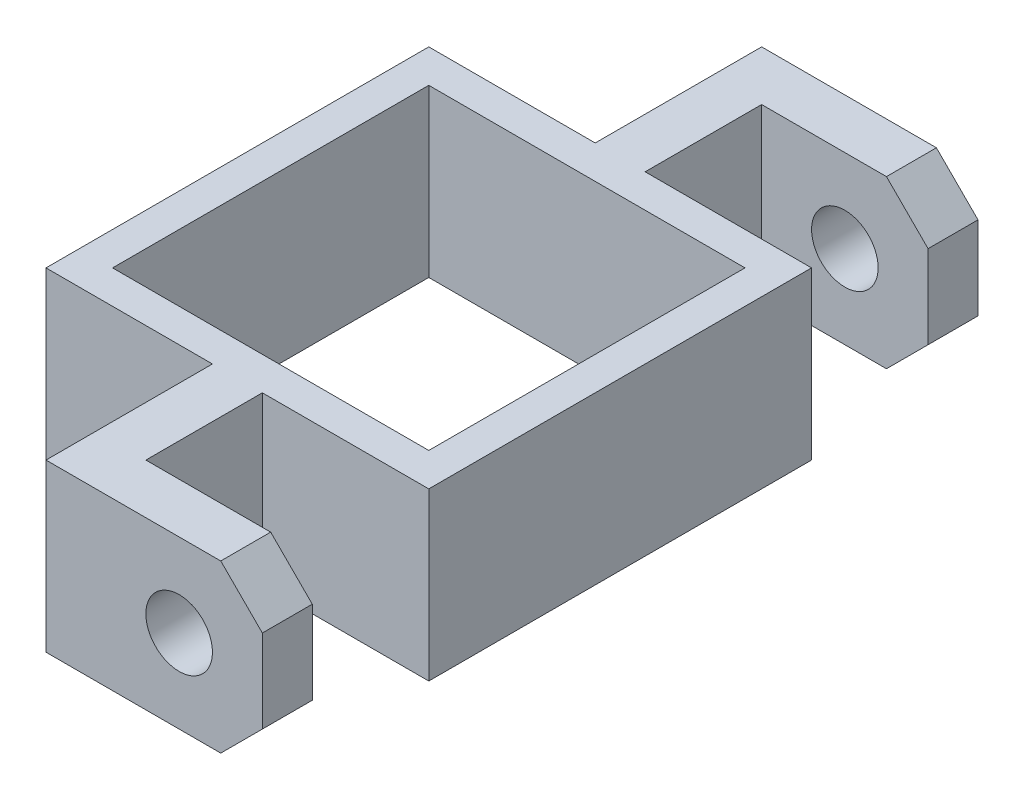
ISO-10303-21;
HEADER;
FILE_DESCRIPTION(('STEP AP214'),'2;1');
FILE_NAME('part.step','',(''),(''),'','','');
FILE_SCHEMA(('AUTOMOTIVE_DESIGN { 1 0 10303 214 1 1 1 1 }'));
ENDSEC;
DATA;
#1=APPLICATION_CONTEXT('core data for automotive mechanical design processes');
#2=APPLICATION_PROTOCOL_DEFINITION('international standard','automotive_design',2000,#1);
#3=PRODUCT_CONTEXT('',#1,'mechanical');
#4=PRODUCT('Part','Part','',(#3));
#5=PRODUCT_RELATED_PRODUCT_CATEGORY('part','',(#4));
#6=PRODUCT_DEFINITION_FORMATION('','',#4);
#7=PRODUCT_DEFINITION_CONTEXT('part definition',#1,'design');
#8=PRODUCT_DEFINITION('design','',#6,#7);
#9=PRODUCT_DEFINITION_SHAPE('','',#8);
#10=(LENGTH_UNIT() NAMED_UNIT(*) SI_UNIT(.MILLI.,.METRE.));
#11=(NAMED_UNIT(*) PLANE_ANGLE_UNIT() SI_UNIT($,.RADIAN.));
#12=(NAMED_UNIT(*) SI_UNIT($,.STERADIAN.) SOLID_ANGLE_UNIT());
#13=UNCERTAINTY_MEASURE_WITH_UNIT(LENGTH_MEASURE(1.E-05),#10,'distance_accuracy_value','');
#14=(GEOMETRIC_REPRESENTATION_CONTEXT(3) GLOBAL_UNCERTAINTY_ASSIGNED_CONTEXT((#13)) GLOBAL_UNIT_ASSIGNED_CONTEXT((#10,
#11,#12)) REPRESENTATION_CONTEXT('',''));
#15=CARTESIAN_POINT('',(0.,0.,0.));
#16=DIRECTION('',(0.,0.,1.));
#17=DIRECTION('',(1.,0.,0.));
#18=AXIS2_PLACEMENT_3D('',#15,#16,#17);
#19=CARTESIAN_POINT('',(-11.5,10.,11.5));
#20=DIRECTION('',(0.,0.,-1.));
#21=DIRECTION('',(-1.,0.,0.));
#22=AXIS2_PLACEMENT_3D('',#19,#20,#21);
#23=PLANE('',#22);
#24=DIRECTION('',(0.,-1.,0.));
#25=VECTOR('',#24,1.);
#26=CARTESIAN_POINT('',(-1.5,10.,11.5));
#27=LINE('',#26,#25);
#28=CARTESIAN_POINT('',(-1.5,10.,11.5));
#29=VERTEX_POINT('',#28);
#30=CARTESIAN_POINT('',(-1.5,0.,11.5));
#31=VERTEX_POINT('',#30);
#32=EDGE_CURVE('E63',#29,#31,#27,.T.);
#33=ORIENTED_EDGE('',*,*,#32,.F.);
#34=DIRECTION('',(1.,0.,0.));
#35=VECTOR('',#34,1.);
#36=CARTESIAN_POINT('',(-11.5,10.,11.5));
#37=LINE('',#36,#35);
#38=CARTESIAN_POINT('',(-11.5,10.,11.5));
#39=VERTEX_POINT('',#38);
#40=EDGE_CURVE('E210',#39,#29,#37,.T.);
#41=ORIENTED_EDGE('',*,*,#40,.F.);
#42=DIRECTION('',(0.,-1.,0.));
#43=VECTOR('',#42,1.);
#44=CARTESIAN_POINT('',(-11.5,10.,11.5));
#45=LINE('',#44,#43);
#46=CARTESIAN_POINT('',(-11.5,0.,11.5));
#47=VERTEX_POINT('',#46);
#48=EDGE_CURVE('E392',#39,#47,#45,.T.);
#49=ORIENTED_EDGE('',*,*,#48,.T.);
#50=DIRECTION('',(1.,0.,0.));
#51=VECTOR('',#50,1.);
#52=CARTESIAN_POINT('',(-11.5,0.,11.5));
#53=LINE('',#52,#51);
#54=EDGE_CURVE('E372',#47,#31,#53,.T.);
#55=ORIENTED_EDGE('',*,*,#54,.T.);
#56=EDGE_LOOP('',(#33,#41,#49,#55));
#57=FACE_BOUND('',#56,.T.);
#58=ADVANCED_FACE('F39',(#57),#23,.F.);
#59=CARTESIAN_POINT('',(-11.5,10.,-11.5));
#60=DIRECTION('',(0.,0.,1.));
#61=DIRECTION('',(1.,0.,0.));
#62=AXIS2_PLACEMENT_3D('',#59,#60,#61);
#63=PLANE('',#62);
#64=DIRECTION('',(0.,-1.,0.));
#65=VECTOR('',#64,1.);
#66=CARTESIAN_POINT('',(1.5,10.,-11.5));
#67=LINE('',#66,#65);
#68=CARTESIAN_POINT('',(1.5,10.,-11.5));
#69=VERTEX_POINT('',#68);
#70=CARTESIAN_POINT('',(1.5,0.,-11.5));
#71=VERTEX_POINT('',#70);
#72=EDGE_CURVE('E318',#69,#71,#67,.T.);
#73=ORIENTED_EDGE('',*,*,#72,.F.);
#74=DIRECTION('',(-1.,0.,0.));
#75=VECTOR('',#74,1.);
#76=CARTESIAN_POINT('',(-11.5,10.,-11.5));
#77=LINE('',#76,#75);
#78=CARTESIAN_POINT('',(11.5,10.,-11.5));
#79=VERTEX_POINT('',#78);
#80=EDGE_CURVE('E373',#79,#69,#77,.T.);
#81=ORIENTED_EDGE('',*,*,#80,.F.);
#82=DIRECTION('',(0.,-1.,0.));
#83=VECTOR('',#82,1.);
#84=CARTESIAN_POINT('',(11.5,10.,-11.5));
#85=LINE('',#84,#83);
#86=CARTESIAN_POINT('',(11.5,0.,-11.5));
#87=VERTEX_POINT('',#86);
#88=EDGE_CURVE('E11',#79,#87,#85,.T.);
#89=ORIENTED_EDGE('',*,*,#88,.T.);
#90=DIRECTION('',(-1.,0.,0.));
#91=VECTOR('',#90,1.);
#92=CARTESIAN_POINT('',(-11.5,0.,-11.5));
#93=LINE('',#92,#91);
#94=EDGE_CURVE('E383',#87,#71,#93,.T.);
#95=ORIENTED_EDGE('',*,*,#94,.T.);
#96=EDGE_LOOP('',(#73,#81,#89,#95));
#97=FACE_BOUND('',#96,.T.);
#98=ADVANCED_FACE('F411',(#97),#63,.F.);
#99=CARTESIAN_POINT('',(0.,10.,0.));
#100=DIRECTION('',(0.,1.,0.));
#101=DIRECTION('',(0.,0.,1.));
#102=AXIS2_PLACEMENT_3D('',#99,#100,#101);
#103=PLANE('',#102);
#104=DIRECTION('',(0.,0.,-1.));
#105=VECTOR('',#104,1.);
#106=CARTESIAN_POINT('',(11.5,10.,-11.5));
#107=LINE('',#106,#105);
#108=CARTESIAN_POINT('',(11.5,10.,11.5));
#109=VERTEX_POINT('',#108);
#110=EDGE_CURVE('E369',#109,#79,#107,.T.);
#111=ORIENTED_EDGE('',*,*,#110,.T.);
#112=ORIENTED_EDGE('',*,*,#80,.T.);
#113=DIRECTION('',(0.,0.,1.));
#114=VECTOR('',#113,1.);
#115=CARTESIAN_POINT('',(1.5,10.,-11.5));
#116=LINE('',#115,#114);
#117=CARTESIAN_POINT('',(1.5,10.,-18.5));
#118=VERTEX_POINT('',#117);
#119=EDGE_CURVE('E327',#118,#69,#116,.T.);
#120=ORIENTED_EDGE('',*,*,#119,.F.);
#121=DIRECTION('',(1.,0.,0.));
#122=VECTOR('',#121,1.);
#123=CARTESIAN_POINT('',(8.99999999999999,10.,-18.5));
#124=LINE('',#123,#122);
#125=CARTESIAN_POINT('',(8.99999999999999,10.,-18.5));
#126=VERTEX_POINT('',#125);
#127=EDGE_CURVE('E280',#118,#126,#124,.T.);
#128=ORIENTED_EDGE('',*,*,#127,.T.);
#129=DIRECTION('',(0.,0.,1.));
#130=VECTOR('',#129,1.);
#131=CARTESIAN_POINT('',(8.99999999999999,10.,-21.5));
#132=LINE('',#131,#130);
#133=CARTESIAN_POINT('',(8.99999999999999,10.,-21.5));
#134=VERTEX_POINT('',#133);
#135=EDGE_CURVE('E315',#134,#126,#132,.T.);
#136=ORIENTED_EDGE('',*,*,#135,.F.);
#137=DIRECTION('',(1.,0.,0.));
#138=VECTOR('',#137,1.);
#139=CARTESIAN_POINT('',(8.99999999999999,10.,-21.5));
#140=LINE('',#139,#138);
#141=CARTESIAN_POINT('',(-1.5,10.,-21.5));
#142=VERTEX_POINT('',#141);
#143=EDGE_CURVE('E281',#142,#134,#140,.T.);
#144=ORIENTED_EDGE('',*,*,#143,.F.);
#145=DIRECTION('',(0.,0.,1.));
#146=VECTOR('',#145,1.);
#147=CARTESIAN_POINT('',(-1.5,10.,-11.5));
#148=LINE('',#147,#146);
#149=CARTESIAN_POINT('',(-1.5,10.,-11.5));
#150=VERTEX_POINT('',#149);
#151=EDGE_CURVE('E334',#142,#150,#148,.T.);
#152=ORIENTED_EDGE('',*,*,#151,.T.);
#153=CARTESIAN_POINT('',(-11.5,10.,-11.5));
#154=VERTEX_POINT('',#153);
#155=EDGE_CURVE('E371',#150,#154,#77,.T.);
#156=ORIENTED_EDGE('',*,*,#155,.T.);
#157=DIRECTION('',(0.,0.,1.));
#158=VECTOR('',#157,1.);
#159=CARTESIAN_POINT('',(-11.5,10.,-11.5));
#160=LINE('',#159,#158);
#161=EDGE_CURVE('E376',#154,#39,#160,.T.);
#162=ORIENTED_EDGE('',*,*,#161,.T.);
#163=ORIENTED_EDGE('',*,*,#40,.T.);
#164=DIRECTION('',(0.,0.,-1.));
#165=VECTOR('',#164,1.);
#166=CARTESIAN_POINT('',(-1.5,10.,11.5));
#167=LINE('',#166,#165);
#168=CARTESIAN_POINT('',(-1.5,10.,21.5));
#169=VERTEX_POINT('',#168);
#170=EDGE_CURVE('E202',#169,#29,#167,.T.);
#171=ORIENTED_EDGE('',*,*,#170,.F.);
#172=DIRECTION('',(1.,0.,0.));
#173=VECTOR('',#172,1.);
#174=CARTESIAN_POINT('',(8.99999999999999,10.,21.5));
#175=LINE('',#174,#173);
#176=CARTESIAN_POINT('',(8.99999999999999,10.,21.5));
#177=VERTEX_POINT('',#176);
#178=EDGE_CURVE('E208',#169,#177,#175,.T.);
#179=ORIENTED_EDGE('',*,*,#178,.T.);
#180=DIRECTION('',(0.,0.,-1.));
#181=VECTOR('',#180,1.);
#182=CARTESIAN_POINT('',(8.99999999999999,10.,21.5));
#183=LINE('',#182,#181);
#184=CARTESIAN_POINT('',(8.99999999999999,10.,18.5));
#185=VERTEX_POINT('',#184);
#186=EDGE_CURVE('E240',#177,#185,#183,.T.);
#187=ORIENTED_EDGE('',*,*,#186,.T.);
#188=DIRECTION('',(1.,0.,0.));
#189=VECTOR('',#188,1.);
#190=CARTESIAN_POINT('',(8.99999999999999,10.,18.5));
#191=LINE('',#190,#189);
#192=CARTESIAN_POINT('',(1.5,10.,18.5));
#193=VERTEX_POINT('',#192);
#194=EDGE_CURVE('E241',#193,#185,#191,.T.);
#195=ORIENTED_EDGE('',*,*,#194,.F.);
#196=DIRECTION('',(0.,0.,-1.));
#197=VECTOR('',#196,1.);
#198=CARTESIAN_POINT('',(1.5,10.,11.5));
#199=LINE('',#198,#197);
#200=CARTESIAN_POINT('',(1.5,10.,11.5));
#201=VERTEX_POINT('',#200);
#202=EDGE_CURVE('E263',#193,#201,#199,.T.);
#203=ORIENTED_EDGE('',*,*,#202,.T.);
#204=EDGE_CURVE('E55',#201,#109,#37,.T.);
#205=ORIENTED_EDGE('',*,*,#204,.T.);
#206=EDGE_LOOP('',(#111,#112,#120,#128,#136,#144,#152,#156,#162,#163,#171,#179,#187,#195,#203,#205));
#207=FACE_BOUND('',#206,.T.);
#208=DIRECTION('',(-1.,0.,0.));
#209=VECTOR('',#208,1.);
#210=CARTESIAN_POINT('',(-9.5,10.,-9.5));
#211=LINE('',#210,#209);
#212=CARTESIAN_POINT('',(9.5,10.,-9.5));
#213=VERTEX_POINT('',#212);
#214=CARTESIAN_POINT('',(-9.5,10.,-9.5));
#215=VERTEX_POINT('',#214);
#216=EDGE_CURVE('E340',#213,#215,#211,.T.);
#217=ORIENTED_EDGE('',*,*,#216,.F.);
#218=DIRECTION('',(0.,0.,-1.));
#219=VECTOR('',#218,1.);
#220=CARTESIAN_POINT('',(9.5,10.,-9.5));
#221=LINE('',#220,#219);
#222=CARTESIAN_POINT('',(9.5,10.,9.5));
#223=VERTEX_POINT('',#222);
#224=EDGE_CURVE('E338',#223,#213,#221,.T.);
#225=ORIENTED_EDGE('',*,*,#224,.F.);
#226=DIRECTION('',(1.,0.,0.));
#227=VECTOR('',#226,1.);
#228=CARTESIAN_POINT('',(-9.5,10.,9.5));
#229=LINE('',#228,#227);
#230=CARTESIAN_POINT('',(-9.5,10.,9.5));
#231=VERTEX_POINT('',#230);
#232=EDGE_CURVE('E346',#231,#223,#229,.T.);
#233=ORIENTED_EDGE('',*,*,#232,.F.);
#234=DIRECTION('',(0.,0.,1.));
#235=VECTOR('',#234,1.);
#236=CARTESIAN_POINT('',(-9.5,10.,-9.5));
#237=LINE('',#236,#235);
#238=EDGE_CURVE('E343',#215,#231,#237,.T.);
#239=ORIENTED_EDGE('',*,*,#238,.F.);
#240=EDGE_LOOP('',(#217,#225,#233,#239));
#241=FACE_BOUND('',#240,.T.);
#242=ADVANCED_FACE('F205',(#207,#241),#103,.T.);
#243=CARTESIAN_POINT('',(0.,0.,0.));
#244=DIRECTION('',(0.,1.,0.));
#245=DIRECTION('',(0.,0.,1.));
#246=AXIS2_PLACEMENT_3D('',#243,#244,#245);
#247=PLANE('',#246);
#248=DIRECTION('',(0.,0.,-1.));
#249=VECTOR('',#248,1.);
#250=CARTESIAN_POINT('',(11.5,0.,-11.5));
#251=LINE('',#250,#249);
#252=CARTESIAN_POINT('',(11.5,0.,11.5));
#253=VERTEX_POINT('',#252);
#254=EDGE_CURVE('E368',#253,#87,#251,.T.);
#255=ORIENTED_EDGE('',*,*,#254,.F.);
#256=CARTESIAN_POINT('',(1.5,0.,11.5));
#257=VERTEX_POINT('',#256);
#258=EDGE_CURVE('E388',#257,#253,#53,.T.);
#259=ORIENTED_EDGE('',*,*,#258,.F.);
#260=DIRECTION('',(0.,0.,1.));
#261=VECTOR('',#260,1.);
#262=CARTESIAN_POINT('',(1.5,0.,11.5));
#263=LINE('',#262,#261);
#264=CARTESIAN_POINT('',(1.5,0.,18.5));
#265=VERTEX_POINT('',#264);
#266=EDGE_CURVE('E269',#257,#265,#263,.T.);
#267=ORIENTED_EDGE('',*,*,#266,.T.);
#268=DIRECTION('',(-1.,0.,0.));
#269=VECTOR('',#268,1.);
#270=CARTESIAN_POINT('',(-1.5,0.,18.5));
#271=LINE('',#270,#269);
#272=CARTESIAN_POINT('',(8.99999999999999,0.,18.5));
#273=VERTEX_POINT('',#272);
#274=EDGE_CURVE('E243',#273,#265,#271,.T.);
#275=ORIENTED_EDGE('',*,*,#274,.F.);
#276=DIRECTION('',(0.,0.,-1.));
#277=VECTOR('',#276,1.);
#278=CARTESIAN_POINT('',(8.99999999999999,0.,21.5));
#279=LINE('',#278,#277);
#280=CARTESIAN_POINT('',(8.99999999999999,0.,21.5));
#281=VERTEX_POINT('',#280);
#282=EDGE_CURVE('E259',#281,#273,#279,.T.);
#283=ORIENTED_EDGE('',*,*,#282,.F.);
#284=DIRECTION('',(-1.,0.,0.));
#285=VECTOR('',#284,1.);
#286=CARTESIAN_POINT('',(-1.5,0.,21.5));
#287=LINE('',#286,#285);
#288=CARTESIAN_POINT('',(-1.5,0.,21.5));
#289=VERTEX_POINT('',#288);
#290=EDGE_CURVE('E228',#281,#289,#287,.T.);
#291=ORIENTED_EDGE('',*,*,#290,.T.);
#292=DIRECTION('',(0.,0.,1.));
#293=VECTOR('',#292,1.);
#294=CARTESIAN_POINT('',(-1.5,0.,11.5));
#295=LINE('',#294,#293);
#296=EDGE_CURVE('E213',#31,#289,#295,.T.);
#297=ORIENTED_EDGE('',*,*,#296,.F.);
#298=ORIENTED_EDGE('',*,*,#54,.F.);
#299=DIRECTION('',(0.,0.,1.));
#300=VECTOR('',#299,1.);
#301=CARTESIAN_POINT('',(-11.5,0.,-11.5));
#302=LINE('',#301,#300);
#303=CARTESIAN_POINT('',(-11.5,0.,-11.5));
#304=VERTEX_POINT('',#303);
#305=EDGE_CURVE('E386',#304,#47,#302,.T.);
#306=ORIENTED_EDGE('',*,*,#305,.F.);
#307=CARTESIAN_POINT('',(-1.5,0.,-11.5));
#308=VERTEX_POINT('',#307);
#309=EDGE_CURVE('E382',#308,#304,#93,.T.);
#310=ORIENTED_EDGE('',*,*,#309,.F.);
#311=DIRECTION('',(0.,0.,-1.));
#312=VECTOR('',#311,1.);
#313=CARTESIAN_POINT('',(-1.5,0.,-11.5));
#314=LINE('',#313,#312);
#315=CARTESIAN_POINT('',(-1.5,0.,-21.5));
#316=VERTEX_POINT('',#315);
#317=EDGE_CURVE('E332',#308,#316,#314,.T.);
#318=ORIENTED_EDGE('',*,*,#317,.T.);
#319=DIRECTION('',(-1.,0.,0.));
#320=VECTOR('',#319,1.);
#321=CARTESIAN_POINT('',(-1.5,0.,-21.5));
#322=LINE('',#321,#320);
#323=CARTESIAN_POINT('',(8.99999999999999,0.,-21.5));
#324=VERTEX_POINT('',#323);
#325=EDGE_CURVE('E291',#324,#316,#322,.T.);
#326=ORIENTED_EDGE('',*,*,#325,.F.);
#327=DIRECTION('',(0.,0.,1.));
#328=VECTOR('',#327,1.);
#329=CARTESIAN_POINT('',(8.99999999999999,0.,-21.5));
#330=LINE('',#329,#328);
#331=CARTESIAN_POINT('',(8.99999999999999,0.,-18.5));
#332=VERTEX_POINT('',#331);
#333=EDGE_CURVE('E297',#324,#332,#330,.T.);
#334=ORIENTED_EDGE('',*,*,#333,.T.);
#335=DIRECTION('',(-1.,0.,0.));
#336=VECTOR('',#335,1.);
#337=CARTESIAN_POINT('',(-1.5,0.,-18.5));
#338=LINE('',#337,#336);
#339=CARTESIAN_POINT('',(1.5,0.,-18.5));
#340=VERTEX_POINT('',#339);
#341=EDGE_CURVE('E285',#332,#340,#338,.T.);
#342=ORIENTED_EDGE('',*,*,#341,.T.);
#343=DIRECTION('',(0.,0.,-1.));
#344=VECTOR('',#343,1.);
#345=CARTESIAN_POINT('',(1.5,0.,-11.5));
#346=LINE('',#345,#344);
#347=EDGE_CURVE('E321',#71,#340,#346,.T.);
#348=ORIENTED_EDGE('',*,*,#347,.F.);
#349=ORIENTED_EDGE('',*,*,#94,.F.);
#350=EDGE_LOOP('',(#255,#259,#267,#275,#283,#291,#297,#298,#306,#310,#318,#326,#334,#342,#348,#349));
#351=FACE_BOUND('',#350,.T.);
#352=DIRECTION('',(0.,0.,-1.));
#353=VECTOR('',#352,1.);
#354=CARTESIAN_POINT('',(9.5,0.,-9.5));
#355=LINE('',#354,#353);
#356=CARTESIAN_POINT('',(9.5,0.,9.5));
#357=VERTEX_POINT('',#356);
#358=CARTESIAN_POINT('',(9.5,0.,-9.5));
#359=VERTEX_POINT('',#358);
#360=EDGE_CURVE('E337',#357,#359,#355,.T.);
#361=ORIENTED_EDGE('',*,*,#360,.T.);
#362=DIRECTION('',(-1.,0.,0.));
#363=VECTOR('',#362,1.);
#364=CARTESIAN_POINT('',(-9.5,0.,-9.5));
#365=LINE('',#364,#363);
#366=CARTESIAN_POINT('',(-9.5,0.,-9.5));
#367=VERTEX_POINT('',#366);
#368=EDGE_CURVE('E351',#359,#367,#365,.T.);
#369=ORIENTED_EDGE('',*,*,#368,.T.);
#370=DIRECTION('',(0.,0.,1.));
#371=VECTOR('',#370,1.);
#372=CARTESIAN_POINT('',(-9.5,0.,-9.5));
#373=LINE('',#372,#371);
#374=CARTESIAN_POINT('',(-9.5,0.,9.5));
#375=VERTEX_POINT('',#374);
#376=EDGE_CURVE('E354',#367,#375,#373,.T.);
#377=ORIENTED_EDGE('',*,*,#376,.T.);
#378=DIRECTION('',(1.,0.,0.));
#379=VECTOR('',#378,1.);
#380=CARTESIAN_POINT('',(-9.5,0.,9.5));
#381=LINE('',#380,#379);
#382=EDGE_CURVE('E341',#375,#357,#381,.T.);
#383=ORIENTED_EDGE('',*,*,#382,.T.);
#384=EDGE_LOOP('',(#361,#369,#377,#383));
#385=FACE_BOUND('',#384,.T.);
#386=ADVANCED_FACE('F408',(#351,#385),#247,.F.);
#387=CARTESIAN_POINT('',(11.5,10.,-11.5));
#388=DIRECTION('',(-1.,0.,0.));
#389=DIRECTION('',(0.,0.,1.));
#390=AXIS2_PLACEMENT_3D('',#387,#388,#389);
#391=PLANE('',#390);
#392=ORIENTED_EDGE('',*,*,#254,.T.);
#393=ORIENTED_EDGE('',*,*,#88,.F.);
#394=ORIENTED_EDGE('',*,*,#110,.F.);
#395=DIRECTION('',(0.,-1.,0.));
#396=VECTOR('',#395,1.);
#397=CARTESIAN_POINT('',(11.5,10.,11.5));
#398=LINE('',#397,#396);
#399=EDGE_CURVE('E379',#109,#253,#398,.T.);
#400=ORIENTED_EDGE('',*,*,#399,.T.);
#401=EDGE_LOOP('',(#392,#393,#394,#400));
#402=FACE_BOUND('',#401,.T.);
#403=ADVANCED_FACE('F41',(#402),#391,.F.);
#404=ORIENTED_EDGE('',*,*,#155,.F.);
#405=DIRECTION('',(0.,-1.,0.));
#406=VECTOR('',#405,1.);
#407=CARTESIAN_POINT('',(-1.5,10.,-11.5));
#408=LINE('',#407,#406);
#409=EDGE_CURVE('E329',#150,#308,#408,.T.);
#410=ORIENTED_EDGE('',*,*,#409,.T.);
#411=ORIENTED_EDGE('',*,*,#309,.T.);
#412=DIRECTION('',(0.,-1.,0.));
#413=VECTOR('',#412,1.);
#414=CARTESIAN_POINT('',(-11.5,10.,-11.5));
#415=LINE('',#414,#413);
#416=EDGE_CURVE('E48',#154,#304,#415,.T.);
#417=ORIENTED_EDGE('',*,*,#416,.F.);
#418=EDGE_LOOP('',(#404,#410,#411,#417));
#419=FACE_BOUND('',#418,.T.);
#420=ADVANCED_FACE('F418',(#419),#63,.F.);
#421=CARTESIAN_POINT('',(-11.5,10.,-11.5));
#422=DIRECTION('',(1.,0.,0.));
#423=DIRECTION('',(0.,0.,-1.));
#424=AXIS2_PLACEMENT_3D('',#421,#422,#423);
#425=PLANE('',#424);
#426=ORIENTED_EDGE('',*,*,#305,.T.);
#427=ORIENTED_EDGE('',*,*,#48,.F.);
#428=ORIENTED_EDGE('',*,*,#161,.F.);
#429=ORIENTED_EDGE('',*,*,#416,.T.);
#430=EDGE_LOOP('',(#426,#427,#428,#429));
#431=FACE_BOUND('',#430,.T.);
#432=ADVANCED_FACE('F400',(#431),#425,.F.);
#433=ORIENTED_EDGE('',*,*,#204,.F.);
#434=DIRECTION('',(0.,-1.,0.));
#435=VECTOR('',#434,1.);
#436=CARTESIAN_POINT('',(1.5,10.,11.5));
#437=LINE('',#436,#435);
#438=EDGE_CURVE('E261',#201,#257,#437,.T.);
#439=ORIENTED_EDGE('',*,*,#438,.T.);
#440=ORIENTED_EDGE('',*,*,#258,.T.);
#441=ORIENTED_EDGE('',*,*,#399,.F.);
#442=EDGE_LOOP('',(#433,#439,#440,#441));
#443=FACE_BOUND('',#442,.T.);
#444=ADVANCED_FACE('F413',(#443),#23,.F.);
#445=CARTESIAN_POINT('',(9.5,10.,-9.5));
#446=DIRECTION('',(-1.,0.,0.));
#447=DIRECTION('',(0.,0.,1.));
#448=AXIS2_PLACEMENT_3D('',#445,#446,#447);
#449=PLANE('',#448);
#450=ORIENTED_EDGE('',*,*,#360,.F.);
#451=DIRECTION('',(0.,-1.,0.));
#452=VECTOR('',#451,1.);
#453=CARTESIAN_POINT('',(9.5,10.,9.5));
#454=LINE('',#453,#452);
#455=EDGE_CURVE('E348',#223,#357,#454,.T.);
#456=ORIENTED_EDGE('',*,*,#455,.F.);
#457=ORIENTED_EDGE('',*,*,#224,.T.);
#458=DIRECTION('',(0.,-1.,0.));
#459=VECTOR('',#458,1.);
#460=CARTESIAN_POINT('',(9.5,10.,-9.5));
#461=LINE('',#460,#459);
#462=EDGE_CURVE('E365',#213,#359,#461,.T.);
#463=ORIENTED_EDGE('',*,*,#462,.T.);
#464=EDGE_LOOP('',(#450,#456,#457,#463));
#465=FACE_BOUND('',#464,.T.);
#466=ADVANCED_FACE('F422',(#465),#449,.T.);
#467=CARTESIAN_POINT('',(-9.5,10.,-9.5));
#468=DIRECTION('',(0.,0.,1.));
#469=DIRECTION('',(1.,0.,0.));
#470=AXIS2_PLACEMENT_3D('',#467,#468,#469);
#471=PLANE('',#470);
#472=ORIENTED_EDGE('',*,*,#368,.F.);
#473=ORIENTED_EDGE('',*,*,#462,.F.);
#474=ORIENTED_EDGE('',*,*,#216,.T.);
#475=DIRECTION('',(0.,-1.,0.));
#476=VECTOR('',#475,1.);
#477=CARTESIAN_POINT('',(-9.5,10.,-9.5));
#478=LINE('',#477,#476);
#479=EDGE_CURVE('E363',#215,#367,#478,.T.);
#480=ORIENTED_EDGE('',*,*,#479,.T.);
#481=EDGE_LOOP('',(#472,#473,#474,#480));
#482=FACE_BOUND('',#481,.T.);
#483=ADVANCED_FACE('F427',(#482),#471,.T.);
#484=CARTESIAN_POINT('',(-9.5,10.,-9.5));
#485=DIRECTION('',(1.,0.,0.));
#486=DIRECTION('',(0.,0.,-1.));
#487=AXIS2_PLACEMENT_3D('',#484,#485,#486);
#488=PLANE('',#487);
#489=ORIENTED_EDGE('',*,*,#376,.F.);
#490=ORIENTED_EDGE('',*,*,#479,.F.);
#491=ORIENTED_EDGE('',*,*,#238,.T.);
#492=DIRECTION('',(0.,-1.,0.));
#493=VECTOR('',#492,1.);
#494=CARTESIAN_POINT('',(-9.5,10.,9.5));
#495=LINE('',#494,#493);
#496=EDGE_CURVE('E361',#231,#375,#495,.T.);
#497=ORIENTED_EDGE('',*,*,#496,.T.);
#498=EDGE_LOOP('',(#489,#490,#491,#497));
#499=FACE_BOUND('',#498,.T.);
#500=ADVANCED_FACE('F523',(#499),#488,.T.);
#501=CARTESIAN_POINT('',(-9.5,10.,9.5));
#502=DIRECTION('',(0.,0.,-1.));
#503=DIRECTION('',(-1.,0.,0.));
#504=AXIS2_PLACEMENT_3D('',#501,#502,#503);
#505=PLANE('',#504);
#506=ORIENTED_EDGE('',*,*,#382,.F.);
#507=ORIENTED_EDGE('',*,*,#496,.F.);
#508=ORIENTED_EDGE('',*,*,#232,.T.);
#509=ORIENTED_EDGE('',*,*,#455,.T.);
#510=EDGE_LOOP('',(#506,#507,#508,#509));
#511=FACE_BOUND('',#510,.T.);
#512=ADVANCED_FACE('F520',(#511),#505,.T.);
#513=CARTESIAN_POINT('',(-1.5,0.,0.));
#514=DIRECTION('',(1.,0.,0.));
#515=DIRECTION('',(0.,0.,-1.));
#516=AXIS2_PLACEMENT_3D('',#513,#514,#515);
#517=PLANE('',#516);
#518=ORIENTED_EDGE('',*,*,#409,.F.);
#519=ORIENTED_EDGE('',*,*,#151,.F.);
#520=DIRECTION('',(0.,1.,0.));
#521=VECTOR('',#520,1.);
#522=CARTESIAN_POINT('',(-1.5,10.,-21.5));
#523=LINE('',#522,#521);
#524=EDGE_CURVE('E294',#316,#142,#523,.T.);
#525=ORIENTED_EDGE('',*,*,#524,.F.);
#526=ORIENTED_EDGE('',*,*,#317,.F.);
#527=EDGE_LOOP('',(#518,#519,#525,#526));
#528=FACE_BOUND('',#527,.T.);
#529=ADVANCED_FACE('F441',(#528),#517,.F.);
#530=CARTESIAN_POINT('',(1.5,0.,0.));
#531=DIRECTION('',(1.,0.,0.));
#532=DIRECTION('',(0.,0.,-1.));
#533=AXIS2_PLACEMENT_3D('',#530,#531,#532);
#534=PLANE('',#533);
#535=ORIENTED_EDGE('',*,*,#72,.T.);
#536=ORIENTED_EDGE('',*,*,#347,.T.);
#537=DIRECTION('',(0.,1.,0.));
#538=VECTOR('',#537,1.);
#539=CARTESIAN_POINT('',(1.5,10.,-18.5));
#540=LINE('',#539,#538);
#541=EDGE_CURVE('E324',#340,#118,#540,.T.);
#542=ORIENTED_EDGE('',*,*,#541,.T.);
#543=ORIENTED_EDGE('',*,*,#119,.T.);
#544=EDGE_LOOP('',(#535,#536,#542,#543));
#545=FACE_BOUND('',#544,.T.);
#546=ADVANCED_FACE('F456',(#545),#534,.T.);
#547=CARTESIAN_POINT('',(0.,0.,-18.5));
#548=DIRECTION('',(0.,0.,1.));
#549=DIRECTION('',(1.,0.,0.));
#550=AXIS2_PLACEMENT_3D('',#547,#548,#549);
#551=PLANE('',#550);
#552=CARTESIAN_POINT('',(6.5,5.,-18.5));
#553=DIRECTION('',(0.,0.,1.));
#554=DIRECTION('',(1.,0.,0.));
#555=AXIS2_PLACEMENT_3D('',#552,#553,#554);
#556=CIRCLE('',#555,2.);
#557=CARTESIAN_POINT('',(8.5,5.,-18.5));
#558=VERTEX_POINT('',#557);
#559=EDGE_CURVE('E277',#558,#558,#556,.T.);
#560=ORIENTED_EDGE('',*,*,#559,.F.);
#561=EDGE_LOOP('',(#560));
#562=FACE_BOUND('',#561,.T.);
#563=ORIENTED_EDGE('',*,*,#541,.F.);
#564=ORIENTED_EDGE('',*,*,#341,.F.);
#565=DIRECTION('',(-0.707106781186549,-0.707106781186546,0.));
#566=VECTOR('',#565,1.);
#567=CARTESIAN_POINT('',(11.5,2.5,-18.5));
#568=LINE('',#567,#566);
#569=CARTESIAN_POINT('',(11.5,2.5,-18.5));
#570=VERTEX_POINT('',#569);
#571=EDGE_CURVE('E303',#570,#332,#568,.T.);
#572=ORIENTED_EDGE('',*,*,#571,.F.);
#573=DIRECTION('',(0.,-1.,0.));
#574=VECTOR('',#573,1.);
#575=CARTESIAN_POINT('',(11.5,7.5,-18.5));
#576=LINE('',#575,#574);
#577=CARTESIAN_POINT('',(11.5,7.5,-18.5));
#578=VERTEX_POINT('',#577);
#579=EDGE_CURVE('E301',#578,#570,#576,.T.);
#580=ORIENTED_EDGE('',*,*,#579,.F.);
#581=DIRECTION('',(0.707106781186549,-0.707106781186546,0.));
#582=VECTOR('',#581,1.);
#583=CARTESIAN_POINT('',(8.99999999999999,10.,-18.5));
#584=LINE('',#583,#582);
#585=EDGE_CURVE('E299',#126,#578,#584,.T.);
#586=ORIENTED_EDGE('',*,*,#585,.F.);
#587=ORIENTED_EDGE('',*,*,#127,.F.);
#588=EDGE_LOOP('',(#563,#564,#572,#580,#586,#587));
#589=FACE_BOUND('',#588,.T.);
#590=ADVANCED_FACE('F451',(#562,#589),#551,.T.);
#591=CARTESIAN_POINT('',(8.99999999999999,10.,-21.5));
#592=DIRECTION('',(-0.707106781186546,-0.707106781186549,0.));
#593=DIRECTION('',(0.707106781186549,-0.707106781186546,0.));
#594=AXIS2_PLACEMENT_3D('',#591,#592,#593);
#595=PLANE('',#594);
#596=ORIENTED_EDGE('',*,*,#585,.T.);
#597=DIRECTION('',(0.,0.,1.));
#598=VECTOR('',#597,1.);
#599=CARTESIAN_POINT('',(11.5,7.5,-21.5));
#600=LINE('',#599,#598);
#601=CARTESIAN_POINT('',(11.5,7.5,-21.5));
#602=VERTEX_POINT('',#601);
#603=EDGE_CURVE('E312',#602,#578,#600,.T.);
#604=ORIENTED_EDGE('',*,*,#603,.F.);
#605=DIRECTION('',(0.707106781186549,-0.707106781186546,0.));
#606=VECTOR('',#605,1.);
#607=CARTESIAN_POINT('',(8.99999999999999,10.,-21.5));
#608=LINE('',#607,#606);
#609=EDGE_CURVE('E284',#134,#602,#608,.T.);
#610=ORIENTED_EDGE('',*,*,#609,.F.);
#611=ORIENTED_EDGE('',*,*,#135,.T.);
#612=EDGE_LOOP('',(#596,#604,#610,#611));
#613=FACE_BOUND('',#612,.T.);
#614=ADVANCED_FACE('F505',(#613),#595,.F.);
#615=CARTESIAN_POINT('',(11.5,7.5,-21.5));
#616=DIRECTION('',(-1.,0.,0.));
#617=DIRECTION('',(0.,0.,1.));
#618=AXIS2_PLACEMENT_3D('',#615,#616,#617);
#619=PLANE('',#618);
#620=ORIENTED_EDGE('',*,*,#579,.T.);
#621=DIRECTION('',(0.,0.,1.));
#622=VECTOR('',#621,1.);
#623=CARTESIAN_POINT('',(11.5,2.5,-21.5));
#624=LINE('',#623,#622);
#625=CARTESIAN_POINT('',(11.5,2.5,-21.5));
#626=VERTEX_POINT('',#625);
#627=EDGE_CURVE('E309',#626,#570,#624,.T.);
#628=ORIENTED_EDGE('',*,*,#627,.F.);
#629=DIRECTION('',(0.,-1.,0.));
#630=VECTOR('',#629,1.);
#631=CARTESIAN_POINT('',(11.5,7.5,-21.5));
#632=LINE('',#631,#630);
#633=EDGE_CURVE('E287',#602,#626,#632,.T.);
#634=ORIENTED_EDGE('',*,*,#633,.F.);
#635=ORIENTED_EDGE('',*,*,#603,.T.);
#636=EDGE_LOOP('',(#620,#628,#634,#635));
#637=FACE_BOUND('',#636,.T.);
#638=ADVANCED_FACE('F509',(#637),#619,.F.);
#639=CARTESIAN_POINT('',(11.5,2.5,-21.5));
#640=DIRECTION('',(-0.707106781186546,0.707106781186549,0.));
#641=DIRECTION('',(-0.707106781186549,-0.707106781186546,0.));
#642=AXIS2_PLACEMENT_3D('',#639,#640,#641);
#643=PLANE('',#642);
#644=ORIENTED_EDGE('',*,*,#571,.T.);
#645=ORIENTED_EDGE('',*,*,#333,.F.);
#646=DIRECTION('',(-0.707106781186549,-0.707106781186546,0.));
#647=VECTOR('',#646,1.);
#648=CARTESIAN_POINT('',(11.5,2.5,-21.5));
#649=LINE('',#648,#647);
#650=EDGE_CURVE('E289',#626,#324,#649,.T.);
#651=ORIENTED_EDGE('',*,*,#650,.F.);
#652=ORIENTED_EDGE('',*,*,#627,.T.);
#653=EDGE_LOOP('',(#644,#645,#651,#652));
#654=FACE_BOUND('',#653,.T.);
#655=ADVANCED_FACE('F501',(#654),#643,.F.);
#656=CARTESIAN_POINT('',(0.,0.,-21.5));
#657=DIRECTION('',(0.,0.,1.));
#658=DIRECTION('',(1.,0.,0.));
#659=AXIS2_PLACEMENT_3D('',#656,#657,#658);
#660=PLANE('',#659);
#661=CARTESIAN_POINT('',(6.5,5.,-21.5));
#662=DIRECTION('',(0.,0.,-1.));
#663=DIRECTION('',(-1.,0.,0.));
#664=AXIS2_PLACEMENT_3D('',#661,#662,#663);
#665=CIRCLE('',#664,2.);
#666=CARTESIAN_POINT('',(4.5,5.,-21.5));
#667=VERTEX_POINT('',#666);
#668=EDGE_CURVE('E274',#667,#667,#665,.T.);
#669=ORIENTED_EDGE('',*,*,#668,.F.);
#670=EDGE_LOOP('',(#669));
#671=FACE_BOUND('',#670,.T.);
#672=ORIENTED_EDGE('',*,*,#143,.T.);
#673=ORIENTED_EDGE('',*,*,#609,.T.);
#674=ORIENTED_EDGE('',*,*,#633,.T.);
#675=ORIENTED_EDGE('',*,*,#650,.T.);
#676=ORIENTED_EDGE('',*,*,#325,.T.);
#677=ORIENTED_EDGE('',*,*,#524,.T.);
#678=EDGE_LOOP('',(#672,#673,#674,#675,#676,#677));
#679=FACE_BOUND('',#678,.T.);
#680=ADVANCED_FACE('F443',(#671,#679),#660,.F.);
#681=CARTESIAN_POINT('',(6.5,5.,-17.5));
#682=DIRECTION('',(0.,0.,-1.));
#683=DIRECTION('',(-1.,0.,0.));
#684=AXIS2_PLACEMENT_3D('',#681,#682,#683);
#685=CYLINDRICAL_SURFACE('',#684,2.);
#686=ORIENTED_EDGE('',*,*,#559,.T.);
#687=EDGE_LOOP('',(#686));
#688=FACE_BOUND('',#687,.T.);
#689=ORIENTED_EDGE('',*,*,#668,.T.);
#690=EDGE_LOOP('',(#689));
#691=FACE_BOUND('',#690,.T.);
#692=ADVANCED_FACE('F495',(#688,#691),#685,.F.);
#693=CARTESIAN_POINT('',(-1.5,0.,0.));
#694=DIRECTION('',(1.,0.,0.));
#695=DIRECTION('',(0.,0.,1.));
#696=AXIS2_PLACEMENT_3D('',#693,#694,#695);
#697=PLANE('',#696);
#698=ORIENTED_EDGE('',*,*,#32,.T.);
#699=ORIENTED_EDGE('',*,*,#296,.T.);
#700=DIRECTION('',(0.,1.,0.));
#701=VECTOR('',#700,1.);
#702=CARTESIAN_POINT('',(-1.5,10.,21.5));
#703=LINE('',#702,#701);
#704=EDGE_CURVE('E219',#289,#169,#703,.T.);
#705=ORIENTED_EDGE('',*,*,#704,.T.);
#706=ORIENTED_EDGE('',*,*,#170,.T.);
#707=EDGE_LOOP('',(#698,#699,#705,#706));
#708=FACE_BOUND('',#707,.T.);
#709=ADVANCED_FACE('F226',(#708),#697,.F.);
#710=CARTESIAN_POINT('',(1.5,0.,0.));
#711=DIRECTION('',(1.,0.,0.));
#712=DIRECTION('',(0.,0.,1.));
#713=AXIS2_PLACEMENT_3D('',#710,#711,#712);
#714=PLANE('',#713);
#715=ORIENTED_EDGE('',*,*,#438,.F.);
#716=ORIENTED_EDGE('',*,*,#202,.F.);
#717=DIRECTION('',(0.,1.,0.));
#718=VECTOR('',#717,1.);
#719=CARTESIAN_POINT('',(1.5,10.,18.5));
#720=LINE('',#719,#718);
#721=EDGE_CURVE('E266',#265,#193,#720,.T.);
#722=ORIENTED_EDGE('',*,*,#721,.F.);
#723=ORIENTED_EDGE('',*,*,#266,.F.);
#724=EDGE_LOOP('',(#715,#716,#722,#723));
#725=FACE_BOUND('',#724,.T.);
#726=ADVANCED_FACE('F463',(#725),#714,.T.);
#727=CARTESIAN_POINT('',(11.5,2.5,21.5));
#728=DIRECTION('',(0.707106781186546,-0.707106781186549,0.));
#729=DIRECTION('',(0.707106781186549,0.707106781186546,0.));
#730=AXIS2_PLACEMENT_3D('',#727,#728,#729);
#731=PLANE('',#730);
#732=DIRECTION('',(-0.707106781186549,-0.707106781186546,0.));
#733=VECTOR('',#732,1.);
#734=CARTESIAN_POINT('',(11.5,2.5,18.5));
#735=LINE('',#734,#733);
#736=CARTESIAN_POINT('',(11.5,2.5,18.5));
#737=VERTEX_POINT('',#736);
#738=EDGE_CURVE('E246',#737,#273,#735,.T.);
#739=ORIENTED_EDGE('',*,*,#738,.F.);
#740=DIRECTION('',(0.,0.,-1.));
#741=VECTOR('',#740,1.);
#742=CARTESIAN_POINT('',(11.5,2.5,21.5));
#743=LINE('',#742,#741);
#744=CARTESIAN_POINT('',(11.5,2.5,21.5));
#745=VERTEX_POINT('',#744);
#746=EDGE_CURVE('E257',#745,#737,#743,.T.);
#747=ORIENTED_EDGE('',*,*,#746,.F.);
#748=DIRECTION('',(-0.707106781186549,-0.707106781186546,0.));
#749=VECTOR('',#748,1.);
#750=CARTESIAN_POINT('',(11.5,2.5,21.5));
#751=LINE('',#750,#749);
#752=EDGE_CURVE('E230',#745,#281,#751,.T.);
#753=ORIENTED_EDGE('',*,*,#752,.T.);
#754=ORIENTED_EDGE('',*,*,#282,.T.);
#755=EDGE_LOOP('',(#739,#747,#753,#754));
#756=FACE_BOUND('',#755,.T.);
#757=ADVANCED_FACE('F472',(#756),#731,.T.);
#758=CARTESIAN_POINT('',(11.5,7.5,21.5));
#759=DIRECTION('',(1.,0.,0.));
#760=DIRECTION('',(0.,0.,-1.));
#761=AXIS2_PLACEMENT_3D('',#758,#759,#760);
#762=PLANE('',#761);
#763=DIRECTION('',(0.,-1.,0.));
#764=VECTOR('',#763,1.);
#765=CARTESIAN_POINT('',(11.5,7.5,18.5));
#766=LINE('',#765,#764);
#767=CARTESIAN_POINT('',(11.5,7.5,18.5));
#768=VERTEX_POINT('',#767);
#769=EDGE_CURVE('E249',#768,#737,#766,.T.);
#770=ORIENTED_EDGE('',*,*,#769,.F.);
#771=DIRECTION('',(0.,0.,-1.));
#772=VECTOR('',#771,1.);
#773=CARTESIAN_POINT('',(11.5,7.5,21.5));
#774=LINE('',#773,#772);
#775=CARTESIAN_POINT('',(11.5,7.5,21.5));
#776=VERTEX_POINT('',#775);
#777=EDGE_CURVE('E255',#776,#768,#774,.T.);
#778=ORIENTED_EDGE('',*,*,#777,.F.);
#779=DIRECTION('',(0.,-1.,0.));
#780=VECTOR('',#779,1.);
#781=CARTESIAN_POINT('',(11.5,7.5,21.5));
#782=LINE('',#781,#780);
#783=EDGE_CURVE('E236',#776,#745,#782,.T.);
#784=ORIENTED_EDGE('',*,*,#783,.T.);
#785=ORIENTED_EDGE('',*,*,#746,.T.);
#786=EDGE_LOOP('',(#770,#778,#784,#785));
#787=FACE_BOUND('',#786,.T.);
#788=ADVANCED_FACE('F475',(#787),#762,.T.);
#789=CARTESIAN_POINT('',(8.99999999999999,10.,21.5));
#790=DIRECTION('',(0.707106781186546,0.707106781186549,0.));
#791=DIRECTION('',(-0.707106781186549,0.707106781186546,0.));
#792=AXIS2_PLACEMENT_3D('',#789,#790,#791);
#793=PLANE('',#792);
#794=DIRECTION('',(0.707106781186549,-0.707106781186546,0.));
#795=VECTOR('',#794,1.);
#796=CARTESIAN_POINT('',(8.99999999999999,10.,18.5));
#797=LINE('',#796,#795);
#798=EDGE_CURVE('E224',#185,#768,#797,.T.);
#799=ORIENTED_EDGE('',*,*,#798,.F.);
#800=ORIENTED_EDGE('',*,*,#186,.F.);
#801=DIRECTION('',(0.707106781186549,-0.707106781186546,0.));
#802=VECTOR('',#801,1.);
#803=CARTESIAN_POINT('',(8.99999999999999,10.,21.5));
#804=LINE('',#803,#802);
#805=EDGE_CURVE('E223',#177,#776,#804,.T.);
#806=ORIENTED_EDGE('',*,*,#805,.T.);
#807=ORIENTED_EDGE('',*,*,#777,.T.);
#808=EDGE_LOOP('',(#799,#800,#806,#807));
#809=FACE_BOUND('',#808,.T.);
#810=ADVANCED_FACE('F477',(#809),#793,.T.);
#811=CARTESIAN_POINT('',(0.,0.,21.5));
#812=DIRECTION('',(0.,0.,-1.));
#813=DIRECTION('',(1.,0.,0.));
#814=AXIS2_PLACEMENT_3D('',#811,#812,#813);
#815=PLANE('',#814);
#816=CARTESIAN_POINT('',(6.5,5.,21.5));
#817=DIRECTION('',(0.,0.,-1.));
#818=DIRECTION('',(-1.,0.,0.));
#819=AXIS2_PLACEMENT_3D('',#816,#817,#818);
#820=CIRCLE('',#819,2.);
#821=CARTESIAN_POINT('',(4.5,5.,21.5));
#822=VERTEX_POINT('',#821);
#823=EDGE_CURVE('E737',#822,#822,#820,.T.);
#824=ORIENTED_EDGE('',*,*,#823,.T.);
#825=EDGE_LOOP('',(#824));
#826=FACE_BOUND('',#825,.T.);
#827=ORIENTED_EDGE('',*,*,#178,.F.);
#828=ORIENTED_EDGE('',*,*,#704,.F.);
#829=ORIENTED_EDGE('',*,*,#290,.F.);
#830=ORIENTED_EDGE('',*,*,#752,.F.);
#831=ORIENTED_EDGE('',*,*,#783,.F.);
#832=ORIENTED_EDGE('',*,*,#805,.F.);
#833=EDGE_LOOP('',(#827,#828,#829,#830,#831,#832));
#834=FACE_BOUND('',#833,.T.);
#835=ADVANCED_FACE('F217',(#826,#834),#815,.F.);
#836=CARTESIAN_POINT('',(0.,0.,18.5));
#837=DIRECTION('',(0.,0.,-1.));
#838=DIRECTION('',(1.,0.,0.));
#839=AXIS2_PLACEMENT_3D('',#836,#837,#838);
#840=PLANE('',#839);
#841=CARTESIAN_POINT('',(6.5,5.,18.5));
#842=DIRECTION('',(0.,0.,-1.));
#843=DIRECTION('',(-1.,0.,0.));
#844=AXIS2_PLACEMENT_3D('',#841,#842,#843);
#845=CIRCLE('',#844,2.);
#846=CARTESIAN_POINT('',(4.5,5.,18.5));
#847=VERTEX_POINT('',#846);
#848=EDGE_CURVE('E43',#847,#847,#845,.F.);
#849=ORIENTED_EDGE('',*,*,#848,.T.);
#850=EDGE_LOOP('',(#849));
#851=FACE_BOUND('',#850,.T.);
#852=ORIENTED_EDGE('',*,*,#274,.T.);
#853=ORIENTED_EDGE('',*,*,#721,.T.);
#854=ORIENTED_EDGE('',*,*,#194,.T.);
#855=ORIENTED_EDGE('',*,*,#798,.T.);
#856=ORIENTED_EDGE('',*,*,#769,.T.);
#857=ORIENTED_EDGE('',*,*,#738,.T.);
#858=EDGE_LOOP('',(#852,#853,#854,#855,#856,#857));
#859=FACE_BOUND('',#858,.T.);
#860=ADVANCED_FACE('F467',(#851,#859),#840,.T.);
#861=CARTESIAN_POINT('',(6.5,5.,17.5));
#862=DIRECTION('',(0.,0.,1.));
#863=DIRECTION('',(1.,0.,0.));
#864=AXIS2_PLACEMENT_3D('',#861,#862,#863);
#865=CYLINDRICAL_SURFACE('',#864,2.);
#866=ORIENTED_EDGE('',*,*,#848,.F.);
#867=EDGE_LOOP('',(#866));
#868=FACE_BOUND('',#867,.T.);
#869=ORIENTED_EDGE('',*,*,#823,.F.);
#870=EDGE_LOOP('',(#869));
#871=FACE_BOUND('',#870,.T.);
#872=ADVANCED_FACE('F716',(#868,#871),#865,.F.);
#873=CLOSED_SHELL('',(#58,#98,#242,#386,#403,#420,#432,#444,#466,#483,#500,#512,#529,#546,#590,
#614,#638,#655,#680,#692,#709,#726,#757,#788,#810,#835,#860,#872));
#874=MANIFOLD_SOLID_BREP('B2',#873);
#875=ADVANCED_BREP_SHAPE_REPRESENTATION('',(#18,#874),#14);
#876=SHAPE_DEFINITION_REPRESENTATION(#9,#875);
ENDSEC;
END-ISO-10303-21;
